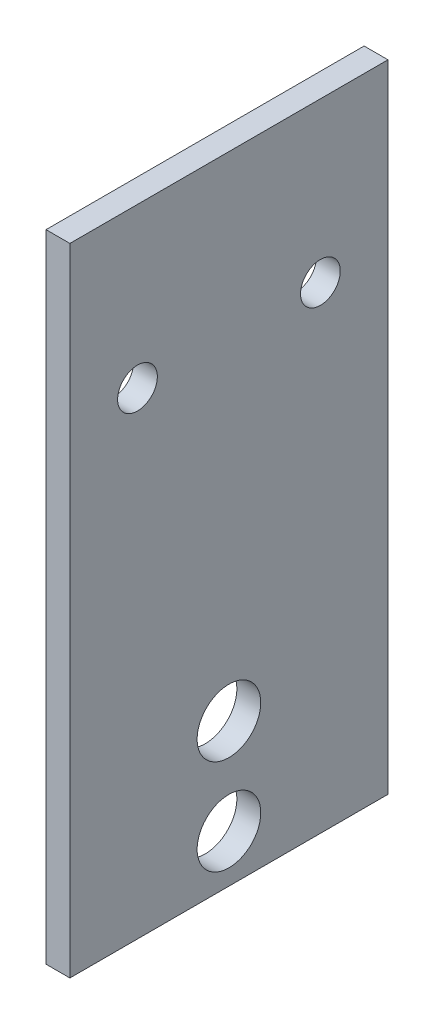
ISO-10303-21;
HEADER;
FILE_DESCRIPTION(('STEP AP214'),'2;1');
FILE_NAME('part.step','',(''),(''),'','','');
FILE_SCHEMA(('AUTOMOTIVE_DESIGN { 1 0 10303 214 1 1 1 1 }'));
ENDSEC;
DATA;
#1=APPLICATION_CONTEXT('core data for automotive mechanical design processes');
#2=APPLICATION_PROTOCOL_DEFINITION('international standard','automotive_design',2000,#1);
#3=PRODUCT_CONTEXT('',#1,'mechanical');
#4=PRODUCT('Part','Part','',(#3));
#5=PRODUCT_RELATED_PRODUCT_CATEGORY('part','',(#4));
#6=PRODUCT_DEFINITION_FORMATION('','',#4);
#7=PRODUCT_DEFINITION_CONTEXT('part definition',#1,'design');
#8=PRODUCT_DEFINITION('design','',#6,#7);
#9=PRODUCT_DEFINITION_SHAPE('','',#8);
#10=(LENGTH_UNIT() NAMED_UNIT(*) SI_UNIT(.MILLI.,.METRE.));
#11=(NAMED_UNIT(*) PLANE_ANGLE_UNIT() SI_UNIT($,.RADIAN.));
#12=(NAMED_UNIT(*) SI_UNIT($,.STERADIAN.) SOLID_ANGLE_UNIT());
#13=UNCERTAINTY_MEASURE_WITH_UNIT(LENGTH_MEASURE(1.E-05),#10,'distance_accuracy_value','');
#14=(GEOMETRIC_REPRESENTATION_CONTEXT(3) GLOBAL_UNCERTAINTY_ASSIGNED_CONTEXT((#13)) GLOBAL_UNIT_ASSIGNED_CONTEXT((#10,
#11,#12)) REPRESENTATION_CONTEXT('',''));
#15=CARTESIAN_POINT('',(0.,0.,0.));
#16=DIRECTION('',(0.,0.,1.));
#17=DIRECTION('',(1.,0.,0.));
#18=AXIS2_PLACEMENT_3D('',#15,#16,#17);
#19=CARTESIAN_POINT('',(3.,-40.,-20.));
#20=DIRECTION('',(0.,0.,1.));
#21=DIRECTION('',(1.,0.,0.));
#22=AXIS2_PLACEMENT_3D('',#19,#20,#21);
#23=PLANE('',#22);
#24=DIRECTION('',(0.,1.,0.));
#25=VECTOR('',#24,1.);
#26=CARTESIAN_POINT('',(0.,-40.,-20.));
#27=LINE('',#26,#25);
#28=CARTESIAN_POINT('',(0.,-40.,-20.));
#29=VERTEX_POINT('',#28);
#30=CARTESIAN_POINT('',(0.,40.,-20.));
#31=VERTEX_POINT('',#30);
#32=EDGE_CURVE('E107',#29,#31,#27,.T.);
#33=ORIENTED_EDGE('',*,*,#32,.T.);
#34=DIRECTION('',(-1.,0.,0.));
#35=VECTOR('',#34,1.);
#36=CARTESIAN_POINT('',(3.,40.,-20.));
#37=LINE('',#36,#35);
#38=CARTESIAN_POINT('',(3.,40.,-20.));
#39=VERTEX_POINT('',#38);
#40=EDGE_CURVE('E11',#39,#31,#37,.T.);
#41=ORIENTED_EDGE('',*,*,#40,.F.);
#42=DIRECTION('',(0.,1.,0.));
#43=VECTOR('',#42,1.);
#44=CARTESIAN_POINT('',(3.,-40.,-20.));
#45=LINE('',#44,#43);
#46=CARTESIAN_POINT('',(3.,-40.,-20.));
#47=VERTEX_POINT('',#46);
#48=EDGE_CURVE('E91',#47,#39,#45,.T.);
#49=ORIENTED_EDGE('',*,*,#48,.F.);
#50=DIRECTION('',(-1.,0.,0.));
#51=VECTOR('',#50,1.);
#52=CARTESIAN_POINT('',(3.,-40.,-20.));
#53=LINE('',#52,#51);
#54=EDGE_CURVE('E103',#47,#29,#53,.T.);
#55=ORIENTED_EDGE('',*,*,#54,.T.);
#56=EDGE_LOOP('',(#33,#41,#49,#55));
#57=FACE_BOUND('',#56,.T.);
#58=ADVANCED_FACE('F39',(#57),#23,.F.);
#59=CARTESIAN_POINT('',(3.,40.,20.));
#60=DIRECTION('',(0.,-1.,0.));
#61=DIRECTION('',(0.,0.,-1.));
#62=AXIS2_PLACEMENT_3D('',#59,#60,#61);
#63=PLANE('',#62);
#64=DIRECTION('',(0.,0.,1.));
#65=VECTOR('',#64,1.);
#66=CARTESIAN_POINT('',(0.,40.,20.));
#67=LINE('',#66,#65);
#68=CARTESIAN_POINT('',(0.,40.,20.));
#69=VERTEX_POINT('',#68);
#70=EDGE_CURVE('E96',#31,#69,#67,.T.);
#71=ORIENTED_EDGE('',*,*,#70,.T.);
#72=DIRECTION('',(-1.,0.,0.));
#73=VECTOR('',#72,1.);
#74=CARTESIAN_POINT('',(3.,40.,20.));
#75=LINE('',#74,#73);
#76=CARTESIAN_POINT('',(3.,40.,20.));
#77=VERTEX_POINT('',#76);
#78=EDGE_CURVE('E48',#77,#69,#75,.T.);
#79=ORIENTED_EDGE('',*,*,#78,.F.);
#80=DIRECTION('',(0.,0.,1.));
#81=VECTOR('',#80,1.);
#82=CARTESIAN_POINT('',(3.,40.,20.));
#83=LINE('',#82,#81);
#84=EDGE_CURVE('E86',#39,#77,#83,.T.);
#85=ORIENTED_EDGE('',*,*,#84,.F.);
#86=ORIENTED_EDGE('',*,*,#40,.T.);
#87=EDGE_LOOP('',(#71,#79,#85,#86));
#88=FACE_BOUND('',#87,.T.);
#89=ADVANCED_FACE('F95',(#88),#63,.F.);
#90=CARTESIAN_POINT('',(3.,-40.,20.));
#91=DIRECTION('',(0.,0.,-1.));
#92=DIRECTION('',(-1.,0.,0.));
#93=AXIS2_PLACEMENT_3D('',#90,#91,#92);
#94=PLANE('',#93);
#95=DIRECTION('',(0.,-1.,0.));
#96=VECTOR('',#95,1.);
#97=CARTESIAN_POINT('',(0.,-40.,20.));
#98=LINE('',#97,#96);
#99=CARTESIAN_POINT('',(0.,-40.,20.));
#100=VERTEX_POINT('',#99);
#101=EDGE_CURVE('E73',#69,#100,#98,.T.);
#102=ORIENTED_EDGE('',*,*,#101,.T.);
#103=DIRECTION('',(-1.,0.,0.));
#104=VECTOR('',#103,1.);
#105=CARTESIAN_POINT('',(3.,-40.,20.));
#106=LINE('',#105,#104);
#107=CARTESIAN_POINT('',(3.,-40.,20.));
#108=VERTEX_POINT('',#107);
#109=EDGE_CURVE('E98',#108,#100,#106,.T.);
#110=ORIENTED_EDGE('',*,*,#109,.F.);
#111=DIRECTION('',(0.,-1.,0.));
#112=VECTOR('',#111,1.);
#113=CARTESIAN_POINT('',(3.,-40.,20.));
#114=LINE('',#113,#112);
#115=EDGE_CURVE('E89',#77,#108,#114,.T.);
#116=ORIENTED_EDGE('',*,*,#115,.F.);
#117=ORIENTED_EDGE('',*,*,#78,.T.);
#118=EDGE_LOOP('',(#102,#110,#116,#117));
#119=FACE_BOUND('',#118,.T.);
#120=ADVANCED_FACE('F99',(#119),#94,.F.);
#121=CARTESIAN_POINT('',(3.,-40.,20.));
#122=DIRECTION('',(0.,1.,0.));
#123=DIRECTION('',(0.,0.,1.));
#124=AXIS2_PLACEMENT_3D('',#121,#122,#123);
#125=PLANE('',#124);
#126=DIRECTION('',(0.,0.,-1.));
#127=VECTOR('',#126,1.);
#128=CARTESIAN_POINT('',(0.,-40.,20.));
#129=LINE('',#128,#127);
#130=EDGE_CURVE('E79',#100,#29,#129,.T.);
#131=ORIENTED_EDGE('',*,*,#130,.T.);
#132=ORIENTED_EDGE('',*,*,#54,.F.);
#133=DIRECTION('',(0.,0.,-1.));
#134=VECTOR('',#133,1.);
#135=CARTESIAN_POINT('',(3.,-40.,20.));
#136=LINE('',#135,#134);
#137=EDGE_CURVE('E56',#108,#47,#136,.T.);
#138=ORIENTED_EDGE('',*,*,#137,.F.);
#139=ORIENTED_EDGE('',*,*,#109,.T.);
#140=EDGE_LOOP('',(#131,#132,#138,#139));
#141=FACE_BOUND('',#140,.T.);
#142=ADVANCED_FACE('F121',(#141),#125,.F.);
#143=CARTESIAN_POINT('',(3.,0.,0.));
#144=DIRECTION('',(-1.,0.,0.));
#145=DIRECTION('',(0.,0.,1.));
#146=AXIS2_PLACEMENT_3D('',#143,#144,#145);
#147=PLANE('',#146);
#148=CARTESIAN_POINT('',(3.,20.,-11.5));
#149=DIRECTION('',(1.,0.,0.));
#150=DIRECTION('',(0.,0.,-1.));
#151=AXIS2_PLACEMENT_3D('',#148,#149,#150);
#152=CIRCLE('',#151,2.5);
#153=CARTESIAN_POINT('',(3.,20.,-14.));
#154=VERTEX_POINT('',#153);
#155=EDGE_CURVE('E136',#154,#154,#152,.T.);
#156=ORIENTED_EDGE('',*,*,#155,.F.);
#157=EDGE_LOOP('',(#156));
#158=FACE_BOUND('',#157,.T.);
#159=CARTESIAN_POINT('',(3.,20.,11.5));
#160=DIRECTION('',(1.,0.,0.));
#161=DIRECTION('',(0.,0.,-1.));
#162=AXIS2_PLACEMENT_3D('',#159,#160,#161);
#163=CIRCLE('',#162,2.5);
#164=CARTESIAN_POINT('',(3.,20.,9.));
#165=VERTEX_POINT('',#164);
#166=EDGE_CURVE('E144',#165,#165,#163,.T.);
#167=ORIENTED_EDGE('',*,*,#166,.F.);
#168=EDGE_LOOP('',(#167));
#169=FACE_BOUND('',#168,.T.);
#170=CARTESIAN_POINT('',(3.,-34.,0.));
#171=DIRECTION('',(1.,0.,0.));
#172=DIRECTION('',(0.,0.,-1.));
#173=AXIS2_PLACEMENT_3D('',#170,#171,#172);
#174=CIRCLE('',#173,4.);
#175=CARTESIAN_POINT('',(3.,-34.,-4.));
#176=VERTEX_POINT('',#175);
#177=EDGE_CURVE('E152',#176,#176,#174,.T.);
#178=ORIENTED_EDGE('',*,*,#177,.F.);
#179=EDGE_LOOP('',(#178));
#180=FACE_BOUND('',#179,.T.);
#181=CARTESIAN_POINT('',(3.,-22.,0.));
#182=DIRECTION('',(1.,0.,0.));
#183=DIRECTION('',(0.,0.,-1.));
#184=AXIS2_PLACEMENT_3D('',#181,#182,#183);
#185=CIRCLE('',#184,4.);
#186=CARTESIAN_POINT('',(3.,-22.,-4.));
#187=VERTEX_POINT('',#186);
#188=EDGE_CURVE('E128',#187,#187,#185,.T.);
#189=ORIENTED_EDGE('',*,*,#188,.F.);
#190=EDGE_LOOP('',(#189));
#191=FACE_BOUND('',#190,.T.);
#192=ORIENTED_EDGE('',*,*,#48,.T.);
#193=ORIENTED_EDGE('',*,*,#84,.T.);
#194=ORIENTED_EDGE('',*,*,#115,.T.);
#195=ORIENTED_EDGE('',*,*,#137,.T.);
#196=EDGE_LOOP('',(#192,#193,#194,#195));
#197=FACE_BOUND('',#196,.T.);
#198=ADVANCED_FACE('F87',(#158,#169,#180,#191,#197),#147,.F.);
#199=CARTESIAN_POINT('',(0.,0.,0.));
#200=DIRECTION('',(-1.,0.,0.));
#201=DIRECTION('',(0.,0.,1.));
#202=AXIS2_PLACEMENT_3D('',#199,#200,#201);
#203=PLANE('',#202);
#204=CARTESIAN_POINT('',(0.,20.,-11.5));
#205=DIRECTION('',(1.,0.,0.));
#206=DIRECTION('',(0.,0.,-1.));
#207=AXIS2_PLACEMENT_3D('',#204,#205,#206);
#208=CIRCLE('',#207,2.5);
#209=CARTESIAN_POINT('',(0.,20.,-14.));
#210=VERTEX_POINT('',#209);
#211=EDGE_CURVE('E140',#210,#210,#208,.T.);
#212=ORIENTED_EDGE('',*,*,#211,.T.);
#213=EDGE_LOOP('',(#212));
#214=FACE_BOUND('',#213,.T.);
#215=CARTESIAN_POINT('',(0.,20.,11.5));
#216=DIRECTION('',(1.,0.,0.));
#217=DIRECTION('',(0.,0.,-1.));
#218=AXIS2_PLACEMENT_3D('',#215,#216,#217);
#219=CIRCLE('',#218,2.5);
#220=CARTESIAN_POINT('',(0.,20.,9.));
#221=VERTEX_POINT('',#220);
#222=EDGE_CURVE('E148',#221,#221,#219,.T.);
#223=ORIENTED_EDGE('',*,*,#222,.T.);
#224=EDGE_LOOP('',(#223));
#225=FACE_BOUND('',#224,.T.);
#226=CARTESIAN_POINT('',(0.,-34.,0.));
#227=DIRECTION('',(1.,0.,0.));
#228=DIRECTION('',(0.,0.,-1.));
#229=AXIS2_PLACEMENT_3D('',#226,#227,#228);
#230=CIRCLE('',#229,4.);
#231=CARTESIAN_POINT('',(0.,-34.,-4.));
#232=VERTEX_POINT('',#231);
#233=EDGE_CURVE('E132',#232,#232,#230,.T.);
#234=ORIENTED_EDGE('',*,*,#233,.T.);
#235=EDGE_LOOP('',(#234));
#236=FACE_BOUND('',#235,.T.);
#237=CARTESIAN_POINT('',(0.,-22.,0.));
#238=DIRECTION('',(1.,0.,0.));
#239=DIRECTION('',(0.,0.,-1.));
#240=AXIS2_PLACEMENT_3D('',#237,#238,#239);
#241=CIRCLE('',#240,4.);
#242=CARTESIAN_POINT('',(0.,-22.,-4.));
#243=VERTEX_POINT('',#242);
#244=EDGE_CURVE('E111',#243,#243,#241,.T.);
#245=ORIENTED_EDGE('',*,*,#244,.T.);
#246=EDGE_LOOP('',(#245));
#247=FACE_BOUND('',#246,.T.);
#248=ORIENTED_EDGE('',*,*,#32,.F.);
#249=ORIENTED_EDGE('',*,*,#130,.F.);
#250=ORIENTED_EDGE('',*,*,#101,.F.);
#251=ORIENTED_EDGE('',*,*,#70,.F.);
#252=EDGE_LOOP('',(#248,#249,#250,#251));
#253=FACE_BOUND('',#252,.T.);
#254=ADVANCED_FACE('F124',(#214,#225,#236,#247,#253),#203,.T.);
#255=CARTESIAN_POINT('',(0.,-22.,0.));
#256=DIRECTION('',(1.,0.,0.));
#257=DIRECTION('',(0.,0.,-1.));
#258=AXIS2_PLACEMENT_3D('',#255,#256,#257);
#259=CYLINDRICAL_SURFACE('',#258,4.);
#260=ORIENTED_EDGE('',*,*,#244,.F.);
#261=EDGE_LOOP('',(#260));
#262=FACE_BOUND('',#261,.T.);
#263=ORIENTED_EDGE('',*,*,#188,.T.);
#264=EDGE_LOOP('',(#263));
#265=FACE_BOUND('',#264,.T.);
#266=ADVANCED_FACE('F166',(#262,#265),#259,.F.);
#267=CARTESIAN_POINT('',(0.,-34.,0.));
#268=DIRECTION('',(1.,0.,0.));
#269=DIRECTION('',(0.,0.,-1.));
#270=AXIS2_PLACEMENT_3D('',#267,#268,#269);
#271=CYLINDRICAL_SURFACE('',#270,4.);
#272=ORIENTED_EDGE('',*,*,#233,.F.);
#273=EDGE_LOOP('',(#272));
#274=FACE_BOUND('',#273,.T.);
#275=ORIENTED_EDGE('',*,*,#177,.T.);
#276=EDGE_LOOP('',(#275));
#277=FACE_BOUND('',#276,.T.);
#278=ADVANCED_FACE('F162',(#274,#277),#271,.F.);
#279=CARTESIAN_POINT('',(0.,20.,11.5));
#280=DIRECTION('',(1.,0.,0.));
#281=DIRECTION('',(0.,0.,-1.));
#282=AXIS2_PLACEMENT_3D('',#279,#280,#281);
#283=CYLINDRICAL_SURFACE('',#282,2.5);
#284=ORIENTED_EDGE('',*,*,#222,.F.);
#285=EDGE_LOOP('',(#284));
#286=FACE_BOUND('',#285,.T.);
#287=ORIENTED_EDGE('',*,*,#166,.T.);
#288=EDGE_LOOP('',(#287));
#289=FACE_BOUND('',#288,.T.);
#290=ADVANCED_FACE('F165',(#286,#289),#283,.F.);
#291=CARTESIAN_POINT('',(0.,20.,-11.5));
#292=DIRECTION('',(1.,0.,0.));
#293=DIRECTION('',(0.,0.,-1.));
#294=AXIS2_PLACEMENT_3D('',#291,#292,#293);
#295=CYLINDRICAL_SURFACE('',#294,2.5);
#296=ORIENTED_EDGE('',*,*,#211,.F.);
#297=EDGE_LOOP('',(#296));
#298=FACE_BOUND('',#297,.T.);
#299=ORIENTED_EDGE('',*,*,#155,.T.);
#300=EDGE_LOOP('',(#299));
#301=FACE_BOUND('',#300,.T.);
#302=ADVANCED_FACE('F227',(#298,#301),#295,.F.);
#303=CLOSED_SHELL('',(#58,#89,#120,#142,#198,#254,#266,#278,#290,#302));
#304=MANIFOLD_SOLID_BREP('B2',#303);
#305=ADVANCED_BREP_SHAPE_REPRESENTATION('',(#18,#304),#14);
#306=SHAPE_DEFINITION_REPRESENTATION(#9,#305);
ENDSEC;
END-ISO-10303-21;
